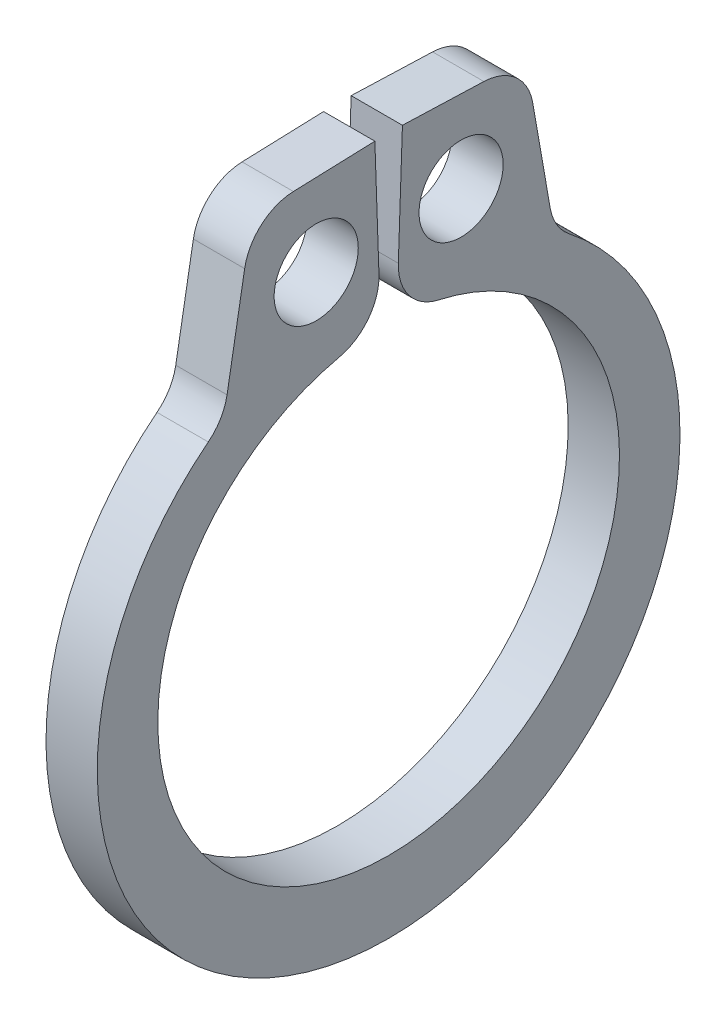
ISO-10303-21;
HEADER;
FILE_DESCRIPTION(('STEP AP214'),'2;1');
FILE_NAME('part.step','',(''),(''),'','','');
FILE_SCHEMA(('AUTOMOTIVE_DESIGN { 1 0 10303 214 1 1 1 1 }'));
ENDSEC;
DATA;
#1=APPLICATION_CONTEXT('core data for automotive mechanical design processes');
#2=APPLICATION_PROTOCOL_DEFINITION('international standard','automotive_design',2000,#1);
#3=PRODUCT_CONTEXT('',#1,'mechanical');
#4=PRODUCT('Part','Part','',(#3));
#5=PRODUCT_RELATED_PRODUCT_CATEGORY('part','',(#4));
#6=PRODUCT_DEFINITION_FORMATION('','',#4);
#7=PRODUCT_DEFINITION_CONTEXT('part definition',#1,'design');
#8=PRODUCT_DEFINITION('design','',#6,#7);
#9=PRODUCT_DEFINITION_SHAPE('','',#8);
#10=(LENGTH_UNIT() NAMED_UNIT(*) SI_UNIT(.MILLI.,.METRE.));
#11=(NAMED_UNIT(*) PLANE_ANGLE_UNIT() SI_UNIT($,.RADIAN.));
#12=(NAMED_UNIT(*) SI_UNIT($,.STERADIAN.) SOLID_ANGLE_UNIT());
#13=UNCERTAINTY_MEASURE_WITH_UNIT(LENGTH_MEASURE(1.E-05),#10,'distance_accuracy_value','');
#14=(GEOMETRIC_REPRESENTATION_CONTEXT(3) GLOBAL_UNCERTAINTY_ASSIGNED_CONTEXT((#13)) GLOBAL_UNIT_ASSIGNED_CONTEXT((#10,
#11,#12)) REPRESENTATION_CONTEXT('',''));
#15=CARTESIAN_POINT('',(0.,0.,0.));
#16=DIRECTION('',(0.,0.,1.));
#17=DIRECTION('',(1.,0.,0.));
#18=AXIS2_PLACEMENT_3D('',#15,#16,#17);
#19=CARTESIAN_POINT('',(0.3175,-0.139755797995519,0.));
#20=DIRECTION('',(1.,0.,0.));
#21=DIRECTION('',(0.,0.,-1.));
#22=AXIS2_PLACEMENT_3D('',#19,#20,#21);
#23=PLANE('',#22);
#24=CARTESIAN_POINT('',(0.3175,3.84454695197116,0.896719010665688));
#25=DIRECTION('',(1.,0.,0.));
#26=DIRECTION('',(0.,0.,-1.));
#27=AXIS2_PLACEMENT_3D('',#24,#25,#26);
#28=CIRCLE('',#27,0.5207);
#29=CARTESIAN_POINT('',(0.3175,3.84454695197116,0.376019010665688));
#30=VERTEX_POINT('',#29);
#31=EDGE_CURVE('E178',#30,#30,#28,.T.);
#32=ORIENTED_EDGE('',*,*,#31,.F.);
#33=EDGE_LOOP('',(#32));
#34=FACE_BOUND('',#33,.T.);
#35=DIRECTION('',(0.,0.985016228348125,0.172461676585942));
#36=VECTOR('',#35,1.);
#37=CARTESIAN_POINT('',(0.3175,4.83333461573526,-1.69371270950398));
#38=LINE('',#37,#36);
#39=CARTESIAN_POINT('',(0.3175,3.08200948404157,-2.00034366619949));
#40=VERTEX_POINT('',#39);
#41=CARTESIAN_POINT('',(0.3175,4.32620248788492,-1.78250399486822));
#42=VERTEX_POINT('',#41);
#43=EDGE_CURVE('E184',#40,#42,#38,.T.);
#44=ORIENTED_EDGE('',*,*,#43,.T.);
#45=CARTESIAN_POINT('',(0.3175,4.21668932325284,-1.15701868986716));
#46=DIRECTION('',(1.,0.,0.));
#47=DIRECTION('',(0.,0.,-1.));
#48=AXIS2_PLACEMENT_3D('',#45,#46,#47);
#49=CIRCLE('',#48,0.635);
#50=CARTESIAN_POINT('',(0.3175,4.85130249840997,-1.17917987027325));
#51=VERTEX_POINT('',#50);
#52=EDGE_CURVE('E223',#42,#51,#49,.T.);
#53=ORIENTED_EDGE('',*,*,#52,.T.);
#54=DIRECTION('',(0.,0.0348994967025009,0.999390827019096));
#55=VECTOR('',#54,1.);
#56=CARTESIAN_POINT('',(0.3175,4.88652144870987,-0.170641089126879));
#57=LINE('',#56,#55);
#58=CARTESIAN_POINT('',(0.3175,4.88652144870987,-0.170641089126879));
#59=VERTEX_POINT('',#58);
#60=EDGE_CURVE('E187',#51,#59,#57,.T.);
#61=ORIENTED_EDGE('',*,*,#60,.T.);
#62=DIRECTION('',(0.,-0.999390827019096,0.0348994967025015));
#63=VECTOR('',#62,1.);
#64=CARTESIAN_POINT('',(0.3175,2.85575928820707,-0.0997253118273956));
#65=LINE('',#64,#63);
#66=CARTESIAN_POINT('',(0.3175,3.43219551467104,-0.119854908418437));
#67=VERTEX_POINT('',#66);
#68=EDGE_CURVE('E155',#59,#67,#65,.T.);
#69=ORIENTED_EDGE('',*,*,#68,.T.);
#70=CARTESIAN_POINT('',(0.3175,3.41003433426495,-0.754468083575563));
#71=DIRECTION('',(1.,0.,0.));
#72=DIRECTION('',(0.,0.,-1.));
#73=AXIS2_PLACEMENT_3D('',#70,#71,#72);
#74=CIRCLE('',#73,0.635);
#75=CARTESIAN_POINT('',(0.3175,2.79002809167132,-0.617292068380006));
#76=VERTEX_POINT('',#75);
#77=EDGE_CURVE('E221',#67,#76,#74,.T.);
#78=ORIENTED_EDGE('',*,*,#77,.T.);
#79=CARTESIAN_POINT('',(0.3175,0.,0.));
#80=DIRECTION('',(-1.,0.,0.));
#81=DIRECTION('',(0.,0.,-1.));
#82=AXIS2_PLACEMENT_3D('',#79,#80,#81);
#83=CIRCLE('',#82,2.8575);
#84=CARTESIAN_POINT('',(0.3175,2.79002809167132,0.617292068380007));
#85=VERTEX_POINT('',#84);
#86=EDGE_CURVE('E190',#76,#85,#83,.T.);
#87=ORIENTED_EDGE('',*,*,#86,.T.);
#88=CARTESIAN_POINT('',(0.3175,3.41003433426495,0.754468083575564));
#89=DIRECTION('',(1.,0.,0.));
#90=DIRECTION('',(0.,0.,-1.));
#91=AXIS2_PLACEMENT_3D('',#88,#89,#90);
#92=CIRCLE('',#91,0.635);
#93=CARTESIAN_POINT('',(0.3175,3.43219551467104,0.119854908418438));
#94=VERTEX_POINT('',#93);
#95=EDGE_CURVE('E219',#85,#94,#92,.T.);
#96=ORIENTED_EDGE('',*,*,#95,.T.);
#97=DIRECTION('',(0.,0.999390827019096,0.0348994967025011));
#98=VECTOR('',#97,1.);
#99=CARTESIAN_POINT('',(0.3175,2.85575928820707,0.0997253118273965));
#100=LINE('',#99,#98);
#101=CARTESIAN_POINT('',(0.3175,4.88652144870987,0.170641089126879));
#102=VERTEX_POINT('',#101);
#103=EDGE_CURVE('E193',#94,#102,#100,.T.);
#104=ORIENTED_EDGE('',*,*,#103,.T.);
#105=DIRECTION('',(0.,-0.0348994967025009,0.999390827019096));
#106=VECTOR('',#105,1.);
#107=CARTESIAN_POINT('',(0.3175,4.88652144870987,0.170641089126879));
#108=LINE('',#107,#106);
#109=CARTESIAN_POINT('',(0.3175,4.85130249840997,1.17917987027325));
#110=VERTEX_POINT('',#109);
#111=EDGE_CURVE('E195',#102,#110,#108,.T.);
#112=ORIENTED_EDGE('',*,*,#111,.T.);
#113=CARTESIAN_POINT('',(0.3175,4.21668932325284,1.15701868986716));
#114=DIRECTION('',(1.,0.,0.));
#115=DIRECTION('',(0.,0.,-1.));
#116=AXIS2_PLACEMENT_3D('',#113,#114,#115);
#117=CIRCLE('',#116,0.635);
#118=CARTESIAN_POINT('',(0.3175,4.32620248788492,1.78250399486822));
#119=VERTEX_POINT('',#118);
#120=EDGE_CURVE('E56',#110,#119,#117,.T.);
#121=ORIENTED_EDGE('',*,*,#120,.T.);
#122=DIRECTION('',(0.,-0.985016228348125,0.172461676585943));
#123=VECTOR('',#122,1.);
#124=CARTESIAN_POINT('',(0.3175,4.83333461573526,1.69371270950398));
#125=LINE('',#124,#123);
#126=CARTESIAN_POINT('',(0.3175,3.08200948404156,2.00034366619949));
#127=VERTEX_POINT('',#126);
#128=EDGE_CURVE('E197',#119,#127,#125,.T.);
#129=ORIENTED_EDGE('',*,*,#128,.T.);
#130=CARTESIAN_POINT('',(0.3175,3.19152264867364,2.62582897120055));
#131=DIRECTION('',(1.,0.,0.));
#132=DIRECTION('',(0.,0.,-1.));
#133=AXIS2_PLACEMENT_3D('',#130,#131,#132);
#134=CIRCLE('',#133,0.635);
#135=CARTESIAN_POINT('',(0.3175,2.69282171035792,2.23273563098348));
#136=VERTEX_POINT('',#135);
#137=EDGE_CURVE('E11',#127,#136,#134,.F.);
#138=ORIENTED_EDGE('',*,*,#137,.T.);
#139=CARTESIAN_POINT('',(0.3175,-0.139755797995519,0.));
#140=DIRECTION('',(1.,0.,0.));
#141=DIRECTION('',(0.,0.,-1.));
#142=AXIS2_PLACEMENT_3D('',#139,#140,#141);
#143=CIRCLE('',#142,3.60674420200448);
#144=CARTESIAN_POINT('',(0.3175,2.69282171035792,-2.23273563098348));
#145=VERTEX_POINT('',#144);
#146=EDGE_CURVE('E181',#136,#145,#143,.T.);
#147=ORIENTED_EDGE('',*,*,#146,.T.);
#148=CARTESIAN_POINT('',(0.3175,3.19152264867364,-2.62582897120055));
#149=DIRECTION('',(1.,0.,0.));
#150=DIRECTION('',(0.,0.,-1.));
#151=AXIS2_PLACEMENT_3D('',#148,#149,#150);
#152=CIRCLE('',#151,0.635);
#153=EDGE_CURVE('E243',#145,#40,#152,.F.);
#154=ORIENTED_EDGE('',*,*,#153,.T.);
#155=EDGE_LOOP('',(#44,#53,#61,#69,#78,#87,#96,#104,#112,#121,#129,#138,#147,#154));
#156=FACE_BOUND('',#155,.T.);
#157=CARTESIAN_POINT('',(0.3175,3.84454695197116,-0.896719010665688));
#158=DIRECTION('',(1.,0.,0.));
#159=DIRECTION('',(0.,0.,-1.));
#160=AXIS2_PLACEMENT_3D('',#157,#158,#159);
#161=CIRCLE('',#160,0.5207);
#162=CARTESIAN_POINT('',(0.3175,3.84454695197116,-1.41741901066569));
#163=VERTEX_POINT('',#162);
#164=EDGE_CURVE('E175',#163,#163,#161,.T.);
#165=ORIENTED_EDGE('',*,*,#164,.F.);
#166=EDGE_LOOP('',(#165));
#167=FACE_BOUND('',#166,.T.);
#168=ADVANCED_FACE('F34',(#34,#156,#167),#23,.T.);
#169=CARTESIAN_POINT('',(0.3175,-0.139755797995519,0.));
#170=DIRECTION('',(-1.,0.,0.));
#171=DIRECTION('',(0.,0.,1.));
#172=AXIS2_PLACEMENT_3D('',#169,#170,#171);
#173=CYLINDRICAL_SURFACE('',#172,3.60674420200448);
#174=CARTESIAN_POINT('',(-0.3175,-0.139755797995519,0.));
#175=DIRECTION('',(1.,0.,0.));
#176=DIRECTION('',(0.,0.,-1.));
#177=AXIS2_PLACEMENT_3D('',#174,#175,#176);
#178=CIRCLE('',#177,3.60674420200448);
#179=CARTESIAN_POINT('',(-0.3175,2.69282171035792,2.23273563098348));
#180=VERTEX_POINT('',#179);
#181=CARTESIAN_POINT('',(-0.3175,2.69282171035792,-2.23273563098348));
#182=VERTEX_POINT('',#181);
#183=EDGE_CURVE('E247',#180,#182,#178,.T.);
#184=ORIENTED_EDGE('',*,*,#183,.T.);
#185=DIRECTION('',(-1.,0.,0.));
#186=VECTOR('',#185,1.);
#187=CARTESIAN_POINT('',(0.3175,2.69282171035792,-2.23273563098348));
#188=LINE('',#187,#186);
#189=EDGE_CURVE('E208',#182,#145,#188,.F.);
#190=ORIENTED_EDGE('',*,*,#189,.T.);
#191=ORIENTED_EDGE('',*,*,#146,.F.);
#192=DIRECTION('',(-1.,0.,0.));
#193=VECTOR('',#192,1.);
#194=CARTESIAN_POINT('',(0.3175,2.69282171035792,2.23273563098348));
#195=LINE('',#194,#193);
#196=EDGE_CURVE('E205',#136,#180,#195,.T.);
#197=ORIENTED_EDGE('',*,*,#196,.T.);
#198=EDGE_LOOP('',(#184,#190,#191,#197));
#199=FACE_BOUND('',#198,.T.);
#200=ADVANCED_FACE('F257',(#199),#173,.T.);
#201=CARTESIAN_POINT('',(0.3175,4.83333461573526,-1.69371270950398));
#202=DIRECTION('',(0.,-0.172461676585942,0.985016228348125));
#203=DIRECTION('',(0.,-0.985016228348125,-0.172461676585942));
#204=AXIS2_PLACEMENT_3D('',#201,#202,#203);
#205=PLANE('',#204);
#206=ORIENTED_EDGE('',*,*,#43,.F.);
#207=DIRECTION('',(1.,0.,0.));
#208=VECTOR('',#207,1.);
#209=CARTESIAN_POINT('',(-0.3175,3.08200948404157,-2.00034366619949));
#210=LINE('',#209,#208);
#211=CARTESIAN_POINT('',(-0.3175,3.08200948404157,-2.00034366619949));
#212=VERTEX_POINT('',#211);
#213=EDGE_CURVE('E202',#40,#212,#210,.F.);
#214=ORIENTED_EDGE('',*,*,#213,.T.);
#215=DIRECTION('',(0.,0.985016228348125,0.172461676585942));
#216=VECTOR('',#215,1.);
#217=CARTESIAN_POINT('',(-0.3175,4.83333461573526,-1.69371270950398));
#218=LINE('',#217,#216);
#219=CARTESIAN_POINT('',(-0.3175,4.32620248788492,-1.78250399486822));
#220=VERTEX_POINT('',#219);
#221=EDGE_CURVE('E148',#212,#220,#218,.T.);
#222=ORIENTED_EDGE('',*,*,#221,.T.);
#223=DIRECTION('',(-1.,0.,0.));
#224=VECTOR('',#223,1.);
#225=CARTESIAN_POINT('',(0.3175,4.32620248788492,-1.78250399486822));
#226=LINE('',#225,#224);
#227=EDGE_CURVE('E156',#220,#42,#226,.F.);
#228=ORIENTED_EDGE('',*,*,#227,.T.);
#229=EDGE_LOOP('',(#206,#214,#222,#228));
#230=FACE_BOUND('',#229,.T.);
#231=ADVANCED_FACE('F265',(#230),#205,.F.);
#232=CARTESIAN_POINT('',(0.3175,4.88652144870987,-0.170641089126879));
#233=DIRECTION('',(0.,-0.999390827019096,0.0348994967025009));
#234=DIRECTION('',(0.,-0.0348994967025009,-0.999390827019096));
#235=AXIS2_PLACEMENT_3D('',#232,#233,#234);
#236=PLANE('',#235);
#237=ORIENTED_EDGE('',*,*,#60,.F.);
#238=DIRECTION('',(-1.,0.,0.));
#239=VECTOR('',#238,1.);
#240=CARTESIAN_POINT('',(0.3175,4.85130249840997,-1.17917987027325));
#241=LINE('',#240,#239);
#242=CARTESIAN_POINT('',(-0.3175,4.85130249840997,-1.17917987027325));
#243=VERTEX_POINT('',#242);
#244=EDGE_CURVE('E144',#51,#243,#241,.T.);
#245=ORIENTED_EDGE('',*,*,#244,.T.);
#246=DIRECTION('',(0.,0.0348994967025009,0.999390827019096));
#247=VECTOR('',#246,1.);
#248=CARTESIAN_POINT('',(-0.3175,4.88652144870987,-0.170641089126879));
#249=LINE('',#248,#247);
#250=CARTESIAN_POINT('',(-0.3175,4.88652144870987,-0.170641089126879));
#251=VERTEX_POINT('',#250);
#252=EDGE_CURVE('E137',#243,#251,#249,.T.);
#253=ORIENTED_EDGE('',*,*,#252,.T.);
#254=DIRECTION('',(-1.,0.,0.));
#255=VECTOR('',#254,1.);
#256=CARTESIAN_POINT('',(0.3175,4.88652144870987,-0.170641089126879));
#257=LINE('',#256,#255);
#258=EDGE_CURVE('E141',#59,#251,#257,.T.);
#259=ORIENTED_EDGE('',*,*,#258,.F.);
#260=EDGE_LOOP('',(#237,#245,#253,#259));
#261=FACE_BOUND('',#260,.T.);
#262=ADVANCED_FACE('F140',(#261),#236,.F.);
#263=CARTESIAN_POINT('',(0.3175,2.85575928820707,-0.0997253118273956));
#264=DIRECTION('',(0.,-0.0348994967025015,-0.999390827019096));
#265=DIRECTION('',(0.,0.999390827019096,-0.0348994967025015));
#266=AXIS2_PLACEMENT_3D('',#263,#264,#265);
#267=PLANE('',#266);
#268=DIRECTION('',(0.,-0.999390827019096,0.0348994967025015));
#269=VECTOR('',#268,1.);
#270=CARTESIAN_POINT('',(-0.3175,2.85575928820707,-0.0997253118273956));
#271=LINE('',#270,#269);
#272=CARTESIAN_POINT('',(-0.3175,3.43219551467104,-0.119854908418437));
#273=VERTEX_POINT('',#272);
#274=EDGE_CURVE('E147',#251,#273,#271,.T.);
#275=ORIENTED_EDGE('',*,*,#274,.T.);
#276=DIRECTION('',(-1.,0.,0.));
#277=VECTOR('',#276,1.);
#278=CARTESIAN_POINT('',(0.3175,3.43219551467104,-0.119854908418437));
#279=LINE('',#278,#277);
#280=EDGE_CURVE('E230',#273,#67,#279,.F.);
#281=ORIENTED_EDGE('',*,*,#280,.T.);
#282=ORIENTED_EDGE('',*,*,#68,.F.);
#283=ORIENTED_EDGE('',*,*,#258,.T.);
#284=EDGE_LOOP('',(#275,#281,#282,#283));
#285=FACE_BOUND('',#284,.T.);
#286=ADVANCED_FACE('F152',(#285),#267,.F.);
#287=CARTESIAN_POINT('',(0.3175,0.,0.));
#288=DIRECTION('',(-1.,0.,0.));
#289=DIRECTION('',(0.,0.,1.));
#290=AXIS2_PLACEMENT_3D('',#287,#288,#289);
#291=CYLINDRICAL_SURFACE('',#290,2.8575);
#292=ORIENTED_EDGE('',*,*,#86,.F.);
#293=DIRECTION('',(-1.,0.,0.));
#294=VECTOR('',#293,1.);
#295=CARTESIAN_POINT('',(0.3175,2.79002809167132,-0.617292068380006));
#296=LINE('',#295,#294);
#297=CARTESIAN_POINT('',(-0.3175,2.79002809167132,-0.617292068380006));
#298=VERTEX_POINT('',#297);
#299=EDGE_CURVE('E227',#76,#298,#296,.T.);
#300=ORIENTED_EDGE('',*,*,#299,.T.);
#301=CARTESIAN_POINT('',(-0.3175,0.,0.));
#302=DIRECTION('',(-1.,0.,0.));
#303=DIRECTION('',(0.,0.,-1.));
#304=AXIS2_PLACEMENT_3D('',#301,#302,#303);
#305=CIRCLE('',#304,2.8575);
#306=CARTESIAN_POINT('',(-0.3175,2.79002809167132,0.617292068380007));
#307=VERTEX_POINT('',#306);
#308=EDGE_CURVE('E162',#298,#307,#305,.T.);
#309=ORIENTED_EDGE('',*,*,#308,.T.);
#310=DIRECTION('',(-1.,0.,0.));
#311=VECTOR('',#310,1.);
#312=CARTESIAN_POINT('',(0.3175,2.79002809167132,0.617292068380007));
#313=LINE('',#312,#311);
#314=EDGE_CURVE('E225',#307,#85,#313,.F.);
#315=ORIENTED_EDGE('',*,*,#314,.T.);
#316=EDGE_LOOP('',(#292,#300,#309,#315));
#317=FACE_BOUND('',#316,.T.);
#318=ADVANCED_FACE('F277',(#317),#291,.F.);
#319=CARTESIAN_POINT('',(0.3175,2.85575928820707,0.0997253118273965));
#320=DIRECTION('',(0.,-0.0348994967025011,0.999390827019096));
#321=DIRECTION('',(0.,-0.999390827019096,-0.0348994967025011));
#322=AXIS2_PLACEMENT_3D('',#319,#320,#321);
#323=PLANE('',#322);
#324=ORIENTED_EDGE('',*,*,#103,.F.);
#325=DIRECTION('',(-1.,0.,0.));
#326=VECTOR('',#325,1.);
#327=CARTESIAN_POINT('',(0.3175,3.43219551467104,0.119854908418438));
#328=LINE('',#327,#326);
#329=CARTESIAN_POINT('',(-0.3175,3.43219551467104,0.119854908418438));
#330=VERTEX_POINT('',#329);
#331=EDGE_CURVE('E232',#94,#330,#328,.T.);
#332=ORIENTED_EDGE('',*,*,#331,.T.);
#333=DIRECTION('',(0.,0.999390827019096,0.0348994967025011));
#334=VECTOR('',#333,1.);
#335=CARTESIAN_POINT('',(-0.3175,2.85575928820707,0.0997253118273965));
#336=LINE('',#335,#334);
#337=CARTESIAN_POINT('',(-0.3175,4.88652144870987,0.170641089126879));
#338=VERTEX_POINT('',#337);
#339=EDGE_CURVE('E165',#330,#338,#336,.T.);
#340=ORIENTED_EDGE('',*,*,#339,.T.);
#341=DIRECTION('',(-1.,0.,0.));
#342=VECTOR('',#341,1.);
#343=CARTESIAN_POINT('',(0.3175,4.88652144870987,0.170641089126879));
#344=LINE('',#343,#342);
#345=EDGE_CURVE('E157',#102,#338,#344,.T.);
#346=ORIENTED_EDGE('',*,*,#345,.F.);
#347=EDGE_LOOP('',(#324,#332,#340,#346));
#348=FACE_BOUND('',#347,.T.);
#349=ADVANCED_FACE('F287',(#348),#323,.F.);
#350=CARTESIAN_POINT('',(0.3175,4.88652144870987,0.170641089126879));
#351=DIRECTION('',(0.,-0.999390827019096,-0.0348994967025009));
#352=DIRECTION('',(0.,0.0348994967025009,-0.999390827019096));
#353=AXIS2_PLACEMENT_3D('',#350,#351,#352);
#354=PLANE('',#353);
#355=DIRECTION('',(0.,-0.0348994967025009,0.999390827019096));
#356=VECTOR('',#355,1.);
#357=CARTESIAN_POINT('',(-0.3175,4.88652144870987,0.170641089126879));
#358=LINE('',#357,#356);
#359=CARTESIAN_POINT('',(-0.3175,4.85130249840997,1.17917987027325));
#360=VERTEX_POINT('',#359);
#361=EDGE_CURVE('E170',#338,#360,#358,.T.);
#362=ORIENTED_EDGE('',*,*,#361,.T.);
#363=DIRECTION('',(-1.,0.,0.));
#364=VECTOR('',#363,1.);
#365=CARTESIAN_POINT('',(0.3175,4.85130249840997,1.17917987027325));
#366=LINE('',#365,#364);
#367=EDGE_CURVE('E239',#360,#110,#366,.F.);
#368=ORIENTED_EDGE('',*,*,#367,.T.);
#369=ORIENTED_EDGE('',*,*,#111,.F.);
#370=ORIENTED_EDGE('',*,*,#345,.T.);
#371=EDGE_LOOP('',(#362,#368,#369,#370));
#372=FACE_BOUND('',#371,.T.);
#373=ADVANCED_FACE('F294',(#372),#354,.F.);
#374=CARTESIAN_POINT('',(0.3175,4.83333461573526,1.69371270950398));
#375=DIRECTION('',(0.,-0.172461676585943,-0.985016228348125));
#376=DIRECTION('',(0.,0.985016228348125,-0.172461676585943));
#377=AXIS2_PLACEMENT_3D('',#374,#375,#376);
#378=PLANE('',#377);
#379=ORIENTED_EDGE('',*,*,#128,.F.);
#380=DIRECTION('',(-1.,0.,0.));
#381=VECTOR('',#380,1.);
#382=CARTESIAN_POINT('',(0.3175,4.32620248788492,1.78250399486822));
#383=LINE('',#382,#381);
#384=CARTESIAN_POINT('',(-0.3175,4.32620248788492,1.78250399486822));
#385=VERTEX_POINT('',#384);
#386=EDGE_CURVE('E236',#119,#385,#383,.T.);
#387=ORIENTED_EDGE('',*,*,#386,.T.);
#388=DIRECTION('',(0.,-0.985016228348125,0.172461676585943));
#389=VECTOR('',#388,1.);
#390=CARTESIAN_POINT('',(-0.3175,4.83333461573526,1.69371270950398));
#391=LINE('',#390,#389);
#392=CARTESIAN_POINT('',(-0.3175,3.08200948404156,2.00034366619949));
#393=VERTEX_POINT('',#392);
#394=EDGE_CURVE('E173',#385,#393,#391,.T.);
#395=ORIENTED_EDGE('',*,*,#394,.T.);
#396=DIRECTION('',(1.,0.,0.));
#397=VECTOR('',#396,1.);
#398=CARTESIAN_POINT('',(0.3175,3.08200948404157,2.00034366619949));
#399=LINE('',#398,#397);
#400=EDGE_CURVE('E49',#393,#127,#399,.T.);
#401=ORIENTED_EDGE('',*,*,#400,.T.);
#402=EDGE_LOOP('',(#379,#387,#395,#401));
#403=FACE_BOUND('',#402,.T.);
#404=ADVANCED_FACE('F250',(#403),#378,.F.);
#405=CARTESIAN_POINT('',(0.3175,3.84454695197116,0.896719010665688));
#406=DIRECTION('',(-1.,0.,0.));
#407=DIRECTION('',(0.,0.,1.));
#408=AXIS2_PLACEMENT_3D('',#405,#406,#407);
#409=CYLINDRICAL_SURFACE('',#408,0.5207);
#410=ORIENTED_EDGE('',*,*,#31,.T.);
#411=EDGE_LOOP('',(#410));
#412=FACE_BOUND('',#411,.T.);
#413=CARTESIAN_POINT('',(-0.3175,3.84454695197116,0.896719010665688));
#414=DIRECTION('',(1.,0.,0.));
#415=DIRECTION('',(0.,0.,-1.));
#416=AXIS2_PLACEMENT_3D('',#413,#414,#415);
#417=CIRCLE('',#416,0.5207);
#418=CARTESIAN_POINT('',(-0.3175,3.84454695197116,0.376019010665688));
#419=VERTEX_POINT('',#418);
#420=EDGE_CURVE('E332',#419,#419,#417,.T.);
#421=ORIENTED_EDGE('',*,*,#420,.F.);
#422=EDGE_LOOP('',(#421));
#423=FACE_BOUND('',#422,.T.);
#424=ADVANCED_FACE('F301',(#412,#423),#409,.F.);
#425=CARTESIAN_POINT('',(0.3175,3.84454695197116,-0.896719010665688));
#426=DIRECTION('',(-1.,0.,0.));
#427=DIRECTION('',(0.,0.,1.));
#428=AXIS2_PLACEMENT_3D('',#425,#426,#427);
#429=CYLINDRICAL_SURFACE('',#428,0.5207);
#430=ORIENTED_EDGE('',*,*,#164,.T.);
#431=EDGE_LOOP('',(#430));
#432=FACE_BOUND('',#431,.T.);
#433=CARTESIAN_POINT('',(-0.3175,3.84454695197116,-0.896719010665688));
#434=DIRECTION('',(1.,0.,0.));
#435=DIRECTION('',(0.,0.,-1.));
#436=AXIS2_PLACEMENT_3D('',#433,#434,#435);
#437=CIRCLE('',#436,0.5207);
#438=CARTESIAN_POINT('',(-0.3175,3.84454695197116,-1.41741901066569));
#439=VERTEX_POINT('',#438);
#440=EDGE_CURVE('E329',#439,#439,#437,.T.);
#441=ORIENTED_EDGE('',*,*,#440,.F.);
#442=EDGE_LOOP('',(#441));
#443=FACE_BOUND('',#442,.T.);
#444=ADVANCED_FACE('F315',(#432,#443),#429,.F.);
#445=CARTESIAN_POINT('',(-0.3175,-0.139755797995519,0.));
#446=DIRECTION('',(1.,0.,0.));
#447=DIRECTION('',(0.,0.,-1.));
#448=AXIS2_PLACEMENT_3D('',#445,#446,#447);
#449=PLANE('',#448);
#450=ORIENTED_EDGE('',*,*,#440,.T.);
#451=EDGE_LOOP('',(#450));
#452=FACE_BOUND('',#451,.T.);
#453=ORIENTED_EDGE('',*,*,#420,.T.);
#454=EDGE_LOOP('',(#453));
#455=FACE_BOUND('',#454,.T.);
#456=ORIENTED_EDGE('',*,*,#252,.F.);
#457=CARTESIAN_POINT('',(-0.3175,4.21668932325284,-1.15701868986716));
#458=DIRECTION('',(1.,0.,0.));
#459=DIRECTION('',(0.,0.,-1.));
#460=AXIS2_PLACEMENT_3D('',#457,#458,#459);
#461=CIRCLE('',#460,0.635);
#462=EDGE_CURVE('E216',#243,#220,#461,.F.);
#463=ORIENTED_EDGE('',*,*,#462,.T.);
#464=ORIENTED_EDGE('',*,*,#221,.F.);
#465=CARTESIAN_POINT('',(-0.3175,3.19152264867364,-2.62582897120055));
#466=DIRECTION('',(1.,0.,0.));
#467=DIRECTION('',(0.,0.,-1.));
#468=AXIS2_PLACEMENT_3D('',#465,#466,#467);
#469=CIRCLE('',#468,0.635);
#470=EDGE_CURVE('E241',#212,#182,#469,.T.);
#471=ORIENTED_EDGE('',*,*,#470,.T.);
#472=ORIENTED_EDGE('',*,*,#183,.F.);
#473=CARTESIAN_POINT('',(-0.3175,3.19152264867364,2.62582897120055));
#474=DIRECTION('',(1.,0.,0.));
#475=DIRECTION('',(0.,0.,-1.));
#476=AXIS2_PLACEMENT_3D('',#473,#474,#475);
#477=CIRCLE('',#476,0.635);
#478=EDGE_CURVE('E42',#180,#393,#477,.T.);
#479=ORIENTED_EDGE('',*,*,#478,.T.);
#480=ORIENTED_EDGE('',*,*,#394,.F.);
#481=CARTESIAN_POINT('',(-0.3175,4.21668932325284,1.15701868986716));
#482=DIRECTION('',(1.,0.,0.));
#483=DIRECTION('',(0.,0.,-1.));
#484=AXIS2_PLACEMENT_3D('',#481,#482,#483);
#485=CIRCLE('',#484,0.635);
#486=EDGE_CURVE('E211',#385,#360,#485,.F.);
#487=ORIENTED_EDGE('',*,*,#486,.T.);
#488=ORIENTED_EDGE('',*,*,#361,.F.);
#489=ORIENTED_EDGE('',*,*,#339,.F.);
#490=CARTESIAN_POINT('',(-0.3175,3.41003433426495,0.754468083575564));
#491=DIRECTION('',(1.,0.,0.));
#492=DIRECTION('',(0.,0.,-1.));
#493=AXIS2_PLACEMENT_3D('',#490,#491,#492);
#494=CIRCLE('',#493,0.635);
#495=EDGE_CURVE('E213',#330,#307,#494,.F.);
#496=ORIENTED_EDGE('',*,*,#495,.T.);
#497=ORIENTED_EDGE('',*,*,#308,.F.);
#498=CARTESIAN_POINT('',(-0.3175,3.41003433426495,-0.754468083575563));
#499=DIRECTION('',(1.,0.,0.));
#500=DIRECTION('',(0.,0.,-1.));
#501=AXIS2_PLACEMENT_3D('',#498,#499,#500);
#502=CIRCLE('',#501,0.635);
#503=EDGE_CURVE('E161',#298,#273,#502,.F.);
#504=ORIENTED_EDGE('',*,*,#503,.T.);
#505=ORIENTED_EDGE('',*,*,#274,.F.);
#506=EDGE_LOOP('',(#456,#463,#464,#471,#472,#479,#480,#487,#488,#489,#496,#497,#504,#505));
#507=FACE_BOUND('',#506,.T.);
#508=ADVANCED_FACE('F159',(#452,#455,#507),#449,.F.);
#509=CARTESIAN_POINT('',(0.3175,3.19152264867364,-2.62582897120055));
#510=DIRECTION('',(-1.,0.,0.));
#511=DIRECTION('',(0.,0.,1.));
#512=AXIS2_PLACEMENT_3D('',#509,#510,#511);
#513=CYLINDRICAL_SURFACE('',#512,0.635);
#514=ORIENTED_EDGE('',*,*,#153,.F.);
#515=ORIENTED_EDGE('',*,*,#189,.F.);
#516=ORIENTED_EDGE('',*,*,#470,.F.);
#517=ORIENTED_EDGE('',*,*,#213,.F.);
#518=EDGE_LOOP('',(#514,#515,#516,#517));
#519=FACE_BOUND('',#518,.T.);
#520=ADVANCED_FACE('F260',(#519),#513,.F.);
#521=CARTESIAN_POINT('',(0.3175,4.21668932325284,-1.15701868986716));
#522=DIRECTION('',(-1.,0.,0.));
#523=DIRECTION('',(0.,0.,1.));
#524=AXIS2_PLACEMENT_3D('',#521,#522,#523);
#525=CYLINDRICAL_SURFACE('',#524,0.635);
#526=ORIENTED_EDGE('',*,*,#52,.F.);
#527=ORIENTED_EDGE('',*,*,#227,.F.);
#528=ORIENTED_EDGE('',*,*,#462,.F.);
#529=ORIENTED_EDGE('',*,*,#244,.F.);
#530=EDGE_LOOP('',(#526,#527,#528,#529));
#531=FACE_BOUND('',#530,.T.);
#532=ADVANCED_FACE('F270',(#531),#525,.T.);
#533=CARTESIAN_POINT('',(0.3175,3.41003433426495,-0.754468083575563));
#534=DIRECTION('',(-1.,0.,0.));
#535=DIRECTION('',(0.,0.,1.));
#536=AXIS2_PLACEMENT_3D('',#533,#534,#535);
#537=CYLINDRICAL_SURFACE('',#536,0.635);
#538=ORIENTED_EDGE('',*,*,#77,.F.);
#539=ORIENTED_EDGE('',*,*,#280,.F.);
#540=ORIENTED_EDGE('',*,*,#503,.F.);
#541=ORIENTED_EDGE('',*,*,#299,.F.);
#542=EDGE_LOOP('',(#538,#539,#540,#541));
#543=FACE_BOUND('',#542,.T.);
#544=ADVANCED_FACE('F275',(#543),#537,.T.);
#545=CARTESIAN_POINT('',(0.3175,3.41003433426495,0.754468083575564));
#546=DIRECTION('',(-1.,0.,0.));
#547=DIRECTION('',(0.,0.,1.));
#548=AXIS2_PLACEMENT_3D('',#545,#546,#547);
#549=CYLINDRICAL_SURFACE('',#548,0.635);
#550=ORIENTED_EDGE('',*,*,#95,.F.);
#551=ORIENTED_EDGE('',*,*,#314,.F.);
#552=ORIENTED_EDGE('',*,*,#495,.F.);
#553=ORIENTED_EDGE('',*,*,#331,.F.);
#554=EDGE_LOOP('',(#550,#551,#552,#553));
#555=FACE_BOUND('',#554,.T.);
#556=ADVANCED_FACE('F284',(#555),#549,.T.);
#557=CARTESIAN_POINT('',(0.3175,4.21668932325284,1.15701868986716));
#558=DIRECTION('',(-1.,0.,0.));
#559=DIRECTION('',(0.,0.,1.));
#560=AXIS2_PLACEMENT_3D('',#557,#558,#559);
#561=CYLINDRICAL_SURFACE('',#560,0.635);
#562=ORIENTED_EDGE('',*,*,#120,.F.);
#563=ORIENTED_EDGE('',*,*,#367,.F.);
#564=ORIENTED_EDGE('',*,*,#486,.F.);
#565=ORIENTED_EDGE('',*,*,#386,.F.);
#566=EDGE_LOOP('',(#562,#563,#564,#565));
#567=FACE_BOUND('',#566,.T.);
#568=ADVANCED_FACE('F293',(#567),#561,.T.);
#569=CARTESIAN_POINT('',(0.3175,3.19152264867364,2.62582897120055));
#570=DIRECTION('',(-1.,0.,0.));
#571=DIRECTION('',(0.,0.,1.));
#572=AXIS2_PLACEMENT_3D('',#569,#570,#571);
#573=CYLINDRICAL_SURFACE('',#572,0.635);
#574=ORIENTED_EDGE('',*,*,#137,.F.);
#575=ORIENTED_EDGE('',*,*,#400,.F.);
#576=ORIENTED_EDGE('',*,*,#478,.F.);
#577=ORIENTED_EDGE('',*,*,#196,.F.);
#578=EDGE_LOOP('',(#574,#575,#576,#577));
#579=FACE_BOUND('',#578,.T.);
#580=ADVANCED_FACE('F36',(#579),#573,.F.);
#581=CLOSED_SHELL('',(#168,#200,#231,#262,#286,#318,#349,#373,#404,#424,#444,#508,#520,#532,
#544,#556,#568,#580));
#582=MANIFOLD_SOLID_BREP('B2',#581);
#583=ADVANCED_BREP_SHAPE_REPRESENTATION('',(#18,#582),#14);
#584=SHAPE_DEFINITION_REPRESENTATION(#9,#583);
ENDSEC;
END-ISO-10303-21;
